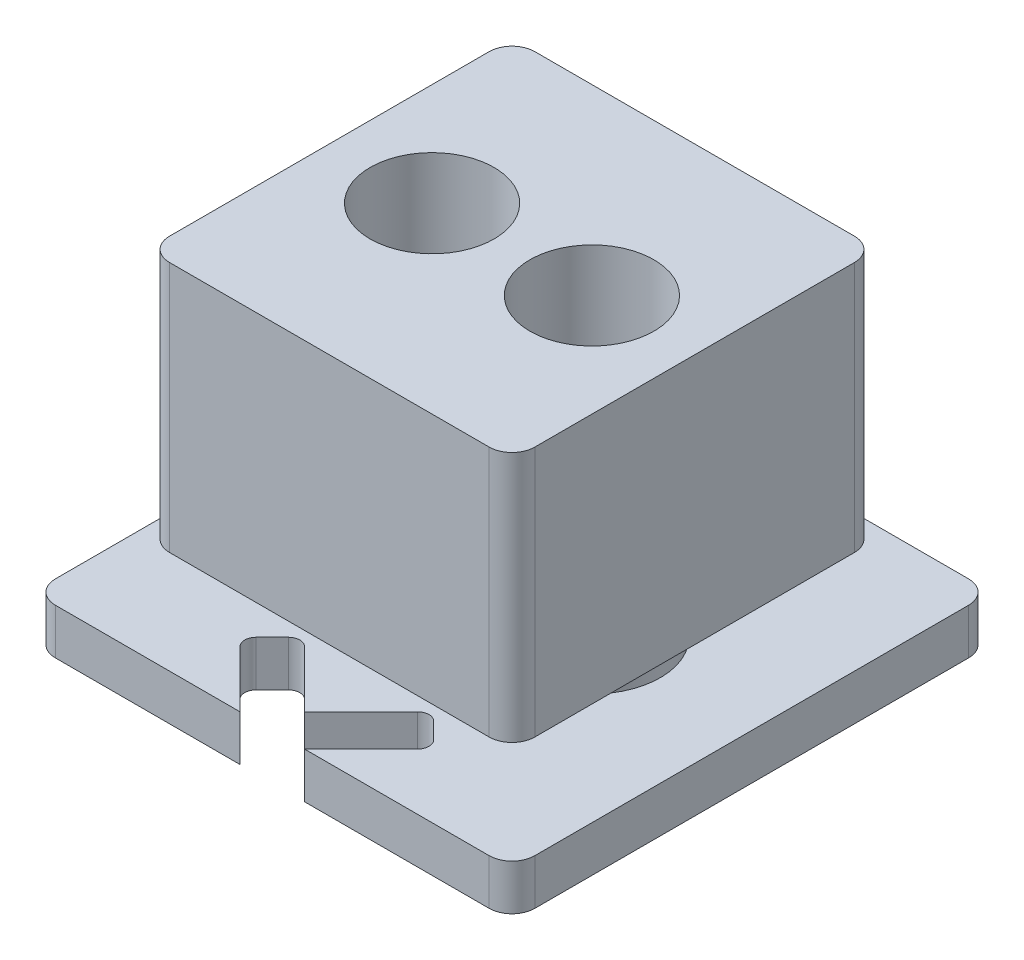
ISO-10303-21;
HEADER;
FILE_DESCRIPTION(('STEP AP214'),'2;1');
FILE_NAME('part.step','',(''),(''),'','','');
FILE_SCHEMA(('AUTOMOTIVE_DESIGN { 1 0 10303 214 1 1 1 1 }'));
ENDSEC;
DATA;
#1=APPLICATION_CONTEXT('core data for automotive mechanical design processes');
#2=APPLICATION_PROTOCOL_DEFINITION('international standard','automotive_design',2000,#1);
#3=PRODUCT_CONTEXT('',#1,'mechanical');
#4=PRODUCT('Part','Part','',(#3));
#5=PRODUCT_RELATED_PRODUCT_CATEGORY('part','',(#4));
#6=PRODUCT_DEFINITION_FORMATION('','',#4);
#7=PRODUCT_DEFINITION_CONTEXT('part definition',#1,'design');
#8=PRODUCT_DEFINITION('design','',#6,#7);
#9=PRODUCT_DEFINITION_SHAPE('','',#8);
#10=(LENGTH_UNIT() NAMED_UNIT(*) SI_UNIT(.MILLI.,.METRE.));
#11=(NAMED_UNIT(*) PLANE_ANGLE_UNIT() SI_UNIT($,.RADIAN.));
#12=(NAMED_UNIT(*) SI_UNIT($,.STERADIAN.) SOLID_ANGLE_UNIT());
#13=UNCERTAINTY_MEASURE_WITH_UNIT(LENGTH_MEASURE(1.E-05),#10,'distance_accuracy_value','');
#14=(GEOMETRIC_REPRESENTATION_CONTEXT(3) GLOBAL_UNCERTAINTY_ASSIGNED_CONTEXT((#13)) GLOBAL_UNIT_ASSIGNED_CONTEXT((#10,
#11,#12)) REPRESENTATION_CONTEXT('',''));
#15=CARTESIAN_POINT('',(0.,0.,0.));
#16=DIRECTION('',(0.,0.,1.));
#17=DIRECTION('',(1.,0.,0.));
#18=AXIS2_PLACEMENT_3D('',#15,#16,#17);
#19=CARTESIAN_POINT('',(-9.5,-2.,10.5));
#20=DIRECTION('',(0.,0.,1.));
#21=DIRECTION('',(1.,0.,0.));
#22=AXIS2_PLACEMENT_3D('',#19,#20,#21);
#23=PLANE('',#22);
#24=DIRECTION('',(-1.,0.,0.));
#25=VECTOR('',#24,1.);
#26=CARTESIAN_POINT('',(-9.5,-4.,10.5));
#27=LINE('',#26,#25);
#28=CARTESIAN_POINT('',(-1.41421356237309,-4.,10.5));
#29=VERTEX_POINT('',#28);
#30=CARTESIAN_POINT('',(-9.5,-4.,10.5));
#31=VERTEX_POINT('',#30);
#32=EDGE_CURVE('E423',#29,#31,#27,.T.);
#33=ORIENTED_EDGE('',*,*,#32,.F.);
#34=DIRECTION('',(0.,1.,0.));
#35=VECTOR('',#34,1.);
#36=CARTESIAN_POINT('',(-1.41421356237309,-4.,10.5));
#37=LINE('',#36,#35);
#38=CARTESIAN_POINT('',(-1.41421356237309,-2.,10.5));
#39=VERTEX_POINT('',#38);
#40=EDGE_CURVE('E324',#29,#39,#37,.T.);
#41=ORIENTED_EDGE('',*,*,#40,.T.);
#42=DIRECTION('',(-1.,0.,0.));
#43=VECTOR('',#42,1.);
#44=CARTESIAN_POINT('',(-9.5,-2.,10.5));
#45=LINE('',#44,#43);
#46=CARTESIAN_POINT('',(-9.5,-2.,10.5));
#47=VERTEX_POINT('',#46);
#48=EDGE_CURVE('E390',#39,#47,#45,.T.);
#49=ORIENTED_EDGE('',*,*,#48,.T.);
#50=DIRECTION('',(0.,-1.,0.));
#51=VECTOR('',#50,1.);
#52=CARTESIAN_POINT('',(-9.5,-2.,10.5));
#53=LINE('',#52,#51);
#54=EDGE_CURVE('E427',#47,#31,#53,.T.);
#55=ORIENTED_EDGE('',*,*,#54,.T.);
#56=EDGE_LOOP('',(#33,#41,#49,#55));
#57=FACE_BOUND('',#56,.T.);
#58=ADVANCED_FACE('F43',(#57),#23,.T.);
#59=CARTESIAN_POINT('',(8.,11.,8.));
#60=DIRECTION('',(-1.,0.,0.));
#61=DIRECTION('',(0.,0.,1.));
#62=AXIS2_PLACEMENT_3D('',#59,#60,#61);
#63=PLANE('',#62);
#64=DIRECTION('',(0.,0.,-1.));
#65=VECTOR('',#64,1.);
#66=CARTESIAN_POINT('',(8.,0.,8.));
#67=LINE('',#66,#65);
#68=CARTESIAN_POINT('',(8.,0.,7.));
#69=VERTEX_POINT('',#68);
#70=CARTESIAN_POINT('',(8.,0.,-7.));
#71=VERTEX_POINT('',#70);
#72=EDGE_CURVE('E463',#69,#71,#67,.T.);
#73=ORIENTED_EDGE('',*,*,#72,.T.);
#74=DIRECTION('',(0.,-1.,0.));
#75=VECTOR('',#74,1.);
#76=CARTESIAN_POINT('',(8.,11.,-7.));
#77=LINE('',#76,#75);
#78=CARTESIAN_POINT('',(8.,11.,-7.));
#79=VERTEX_POINT('',#78);
#80=EDGE_CURVE('E11',#71,#79,#77,.F.);
#81=ORIENTED_EDGE('',*,*,#80,.T.);
#82=DIRECTION('',(0.,0.,-1.));
#83=VECTOR('',#82,1.);
#84=CARTESIAN_POINT('',(8.,11.,8.));
#85=LINE('',#84,#83);
#86=CARTESIAN_POINT('',(8.,11.,7.));
#87=VERTEX_POINT('',#86);
#88=EDGE_CURVE('E464',#87,#79,#85,.T.);
#89=ORIENTED_EDGE('',*,*,#88,.F.);
#90=DIRECTION('',(0.,-1.,0.));
#91=VECTOR('',#90,1.);
#92=CARTESIAN_POINT('',(8.,11.,7.));
#93=LINE('',#92,#91);
#94=EDGE_CURVE('E53',#87,#69,#93,.T.);
#95=ORIENTED_EDGE('',*,*,#94,.T.);
#96=EDGE_LOOP('',(#73,#81,#89,#95));
#97=FACE_BOUND('',#96,.T.);
#98=ADVANCED_FACE('F543',(#97),#63,.F.);
#99=CARTESIAN_POINT('',(-8.,11.,-8.));
#100=DIRECTION('',(0.,0.,1.));
#101=DIRECTION('',(1.,0.,0.));
#102=AXIS2_PLACEMENT_3D('',#99,#100,#101);
#103=PLANE('',#102);
#104=DIRECTION('',(-1.,0.,0.));
#105=VECTOR('',#104,1.);
#106=CARTESIAN_POINT('',(-8.,0.,-8.));
#107=LINE('',#106,#105);
#108=CARTESIAN_POINT('',(7.,0.,-8.));
#109=VERTEX_POINT('',#108);
#110=CARTESIAN_POINT('',(-7.,0.,-8.));
#111=VERTEX_POINT('',#110);
#112=EDGE_CURVE('E484',#109,#111,#107,.T.);
#113=ORIENTED_EDGE('',*,*,#112,.T.);
#114=DIRECTION('',(0.,-1.,0.));
#115=VECTOR('',#114,1.);
#116=CARTESIAN_POINT('',(-7.,11.,-8.));
#117=LINE('',#116,#115);
#118=CARTESIAN_POINT('',(-7.,11.,-8.));
#119=VERTEX_POINT('',#118);
#120=EDGE_CURVE('E516',#111,#119,#117,.F.);
#121=ORIENTED_EDGE('',*,*,#120,.T.);
#122=DIRECTION('',(-1.,0.,0.));
#123=VECTOR('',#122,1.);
#124=CARTESIAN_POINT('',(-8.,11.,-8.));
#125=LINE('',#124,#123);
#126=CARTESIAN_POINT('',(7.,11.,-8.));
#127=VERTEX_POINT('',#126);
#128=EDGE_CURVE('E468',#127,#119,#125,.T.);
#129=ORIENTED_EDGE('',*,*,#128,.F.);
#130=DIRECTION('',(0.,-1.,0.));
#131=VECTOR('',#130,1.);
#132=CARTESIAN_POINT('',(7.,11.,-8.));
#133=LINE('',#132,#131);
#134=EDGE_CURVE('E512',#127,#109,#133,.T.);
#135=ORIENTED_EDGE('',*,*,#134,.T.);
#136=EDGE_LOOP('',(#113,#121,#129,#135));
#137=FACE_BOUND('',#136,.T.);
#138=ADVANCED_FACE('F558',(#137),#103,.F.);
#139=CARTESIAN_POINT('',(-8.,11.,8.));
#140=DIRECTION('',(1.,0.,0.));
#141=DIRECTION('',(0.,0.,-1.));
#142=AXIS2_PLACEMENT_3D('',#139,#140,#141);
#143=PLANE('',#142);
#144=DIRECTION('',(0.,0.,1.));
#145=VECTOR('',#144,1.);
#146=CARTESIAN_POINT('',(-8.,11.,8.));
#147=LINE('',#146,#145);
#148=CARTESIAN_POINT('',(-8.,11.,-7.));
#149=VERTEX_POINT('',#148);
#150=CARTESIAN_POINT('',(-8.,11.,7.));
#151=VERTEX_POINT('',#150);
#152=EDGE_CURVE('E473',#149,#151,#147,.T.);
#153=ORIENTED_EDGE('',*,*,#152,.F.);
#154=DIRECTION('',(0.,-1.,0.));
#155=VECTOR('',#154,1.);
#156=CARTESIAN_POINT('',(-8.,11.,-7.));
#157=LINE('',#156,#155);
#158=CARTESIAN_POINT('',(-8.,0.,-7.));
#159=VERTEX_POINT('',#158);
#160=EDGE_CURVE('E496',#149,#159,#157,.T.);
#161=ORIENTED_EDGE('',*,*,#160,.T.);
#162=DIRECTION('',(0.,0.,1.));
#163=VECTOR('',#162,1.);
#164=CARTESIAN_POINT('',(-8.,0.,8.));
#165=LINE('',#164,#163);
#166=CARTESIAN_POINT('',(-8.,0.,7.));
#167=VERTEX_POINT('',#166);
#168=EDGE_CURVE('E488',#159,#167,#165,.T.);
#169=ORIENTED_EDGE('',*,*,#168,.T.);
#170=DIRECTION('',(0.,-1.,0.));
#171=VECTOR('',#170,1.);
#172=CARTESIAN_POINT('',(-8.,11.,7.));
#173=LINE('',#172,#171);
#174=EDGE_CURVE('E480',#167,#151,#173,.F.);
#175=ORIENTED_EDGE('',*,*,#174,.T.);
#176=EDGE_LOOP('',(#153,#161,#169,#175));
#177=FACE_BOUND('',#176,.T.);
#178=ADVANCED_FACE('F568',(#177),#143,.F.);
#179=CARTESIAN_POINT('',(-8.,11.,8.));
#180=DIRECTION('',(0.,0.,-1.));
#181=DIRECTION('',(-1.,0.,0.));
#182=AXIS2_PLACEMENT_3D('',#179,#180,#181);
#183=PLANE('',#182);
#184=DIRECTION('',(1.,0.,0.));
#185=VECTOR('',#184,1.);
#186=CARTESIAN_POINT('',(-8.,11.,8.));
#187=LINE('',#186,#185);
#188=CARTESIAN_POINT('',(-7.,11.,8.));
#189=VERTEX_POINT('',#188);
#190=CARTESIAN_POINT('',(7.,11.,8.));
#191=VERTEX_POINT('',#190);
#192=EDGE_CURVE('E477',#189,#191,#187,.T.);
#193=ORIENTED_EDGE('',*,*,#192,.F.);
#194=DIRECTION('',(0.,-1.,0.));
#195=VECTOR('',#194,1.);
#196=CARTESIAN_POINT('',(-7.,11.,8.));
#197=LINE('',#196,#195);
#198=CARTESIAN_POINT('',(-7.,0.,8.));
#199=VERTEX_POINT('',#198);
#200=EDGE_CURVE('E533',#189,#199,#197,.T.);
#201=ORIENTED_EDGE('',*,*,#200,.T.);
#202=DIRECTION('',(1.,0.,0.));
#203=VECTOR('',#202,1.);
#204=CARTESIAN_POINT('',(-8.,0.,8.));
#205=LINE('',#204,#203);
#206=CARTESIAN_POINT('',(7.,0.,8.));
#207=VERTEX_POINT('',#206);
#208=EDGE_CURVE('E469',#199,#207,#205,.T.);
#209=ORIENTED_EDGE('',*,*,#208,.T.);
#210=DIRECTION('',(0.,-1.,0.));
#211=VECTOR('',#210,1.);
#212=CARTESIAN_POINT('',(7.,11.,8.));
#213=LINE('',#212,#211);
#214=EDGE_CURVE('E68',#207,#191,#213,.F.);
#215=ORIENTED_EDGE('',*,*,#214,.T.);
#216=EDGE_LOOP('',(#193,#201,#209,#215));
#217=FACE_BOUND('',#216,.T.);
#218=ADVANCED_FACE('F574',(#217),#183,.F.);
#219=CARTESIAN_POINT('',(0.,11.,0.));
#220=DIRECTION('',(0.,-1.,0.));
#221=DIRECTION('',(0.,0.,-1.));
#222=AXIS2_PLACEMENT_3D('',#219,#220,#221);
#223=PLANE('',#222);
#224=CARTESIAN_POINT('',(-3.5,11.,0.));
#225=DIRECTION('',(0.,1.,0.));
#226=DIRECTION('',(0.,0.,1.));
#227=AXIS2_PLACEMENT_3D('',#224,#225,#226);
#228=CIRCLE('',#227,2.715);
#229=CARTESIAN_POINT('',(-3.5,11.,2.715));
#230=VERTEX_POINT('',#229);
#231=EDGE_CURVE('E350',#230,#230,#228,.T.);
#232=ORIENTED_EDGE('',*,*,#231,.F.);
#233=EDGE_LOOP('',(#232));
#234=FACE_BOUND('',#233,.T.);
#235=CARTESIAN_POINT('',(3.5,11.,0.));
#236=DIRECTION('',(0.,1.,0.));
#237=DIRECTION('',(0.,0.,1.));
#238=AXIS2_PLACEMENT_3D('',#235,#236,#237);
#239=CIRCLE('',#238,2.715);
#240=CARTESIAN_POINT('',(3.5,11.,2.715));
#241=VERTEX_POINT('',#240);
#242=EDGE_CURVE('E354',#241,#241,#239,.T.);
#243=ORIENTED_EDGE('',*,*,#242,.F.);
#244=EDGE_LOOP('',(#243));
#245=FACE_BOUND('',#244,.T.);
#246=ORIENTED_EDGE('',*,*,#128,.T.);
#247=CARTESIAN_POINT('',(-7.,11.,-7.));
#248=DIRECTION('',(0.,-1.,0.));
#249=DIRECTION('',(0.,0.,-1.));
#250=AXIS2_PLACEMENT_3D('',#247,#248,#249);
#251=CIRCLE('',#250,1.);
#252=EDGE_CURVE('E528',#119,#149,#251,.F.);
#253=ORIENTED_EDGE('',*,*,#252,.T.);
#254=ORIENTED_EDGE('',*,*,#152,.T.);
#255=CARTESIAN_POINT('',(-7.,11.,7.));
#256=DIRECTION('',(0.,-1.,0.));
#257=DIRECTION('',(0.,0.,-1.));
#258=AXIS2_PLACEMENT_3D('',#255,#256,#257);
#259=CIRCLE('',#258,1.);
#260=EDGE_CURVE('E525',#151,#189,#259,.F.);
#261=ORIENTED_EDGE('',*,*,#260,.T.);
#262=ORIENTED_EDGE('',*,*,#192,.T.);
#263=CARTESIAN_POINT('',(7.,11.,7.));
#264=DIRECTION('',(0.,-1.,0.));
#265=DIRECTION('',(0.,0.,-1.));
#266=AXIS2_PLACEMENT_3D('',#263,#264,#265);
#267=CIRCLE('',#266,1.);
#268=EDGE_CURVE('E519',#191,#87,#267,.F.);
#269=ORIENTED_EDGE('',*,*,#268,.T.);
#270=ORIENTED_EDGE('',*,*,#88,.T.);
#271=CARTESIAN_POINT('',(7.,11.,-7.));
#272=DIRECTION('',(0.,-1.,0.));
#273=DIRECTION('',(0.,0.,-1.));
#274=AXIS2_PLACEMENT_3D('',#271,#272,#273);
#275=CIRCLE('',#274,1.);
#276=EDGE_CURVE('E522',#79,#127,#275,.F.);
#277=ORIENTED_EDGE('',*,*,#276,.T.);
#278=EDGE_LOOP('',(#246,#253,#254,#261,#262,#269,#270,#277));
#279=FACE_BOUND('',#278,.T.);
#280=ADVANCED_FACE('F562',(#234,#245,#279),#223,.F.);
#281=CARTESIAN_POINT('',(0.,0.,0.));
#282=DIRECTION('',(0.,-1.,0.));
#283=DIRECTION('',(0.,0.,-1.));
#284=AXIS2_PLACEMENT_3D('',#281,#282,#283);
#285=PLANE('',#284);
#286=CARTESIAN_POINT('',(3.5,0.,0.));
#287=DIRECTION('',(0.,-1.,0.));
#288=DIRECTION('',(0.,0.,-1.));
#289=AXIS2_PLACEMENT_3D('',#286,#287,#288);
#290=CIRCLE('',#289,3.);
#291=CARTESIAN_POINT('',(3.5,0.,-3.));
#292=VERTEX_POINT('',#291);
#293=EDGE_CURVE('E455',#292,#292,#290,.T.);
#294=ORIENTED_EDGE('',*,*,#293,.F.);
#295=EDGE_LOOP('',(#294));
#296=FACE_BOUND('',#295,.T.);
#297=CARTESIAN_POINT('',(-3.5,0.,0.));
#298=DIRECTION('',(0.,-1.,0.));
#299=DIRECTION('',(0.,0.,-1.));
#300=AXIS2_PLACEMENT_3D('',#297,#298,#299);
#301=CIRCLE('',#300,3.);
#302=CARTESIAN_POINT('',(-3.5,0.,-3.));
#303=VERTEX_POINT('',#302);
#304=EDGE_CURVE('E459',#303,#303,#301,.T.);
#305=ORIENTED_EDGE('',*,*,#304,.F.);
#306=EDGE_LOOP('',(#305));
#307=FACE_BOUND('',#306,.T.);
#308=ORIENTED_EDGE('',*,*,#168,.F.);
#309=CARTESIAN_POINT('',(-7.,0.,-7.));
#310=DIRECTION('',(0.,-1.,0.));
#311=DIRECTION('',(0.,0.,-1.));
#312=AXIS2_PLACEMENT_3D('',#309,#310,#311);
#313=CIRCLE('',#312,1.);
#314=EDGE_CURVE('E509',#159,#111,#313,.T.);
#315=ORIENTED_EDGE('',*,*,#314,.T.);
#316=ORIENTED_EDGE('',*,*,#112,.F.);
#317=CARTESIAN_POINT('',(7.,0.,-7.));
#318=DIRECTION('',(0.,-1.,0.));
#319=DIRECTION('',(0.,0.,-1.));
#320=AXIS2_PLACEMENT_3D('',#317,#318,#319);
#321=CIRCLE('',#320,1.);
#322=EDGE_CURVE('E503',#109,#71,#321,.T.);
#323=ORIENTED_EDGE('',*,*,#322,.T.);
#324=ORIENTED_EDGE('',*,*,#72,.F.);
#325=CARTESIAN_POINT('',(7.,0.,7.));
#326=DIRECTION('',(0.,-1.,0.));
#327=DIRECTION('',(0.,0.,-1.));
#328=AXIS2_PLACEMENT_3D('',#325,#326,#327);
#329=CIRCLE('',#328,1.);
#330=EDGE_CURVE('E500',#69,#207,#329,.T.);
#331=ORIENTED_EDGE('',*,*,#330,.T.);
#332=ORIENTED_EDGE('',*,*,#208,.F.);
#333=CARTESIAN_POINT('',(-7.,0.,7.));
#334=DIRECTION('',(0.,-1.,0.));
#335=DIRECTION('',(0.,0.,-1.));
#336=AXIS2_PLACEMENT_3D('',#333,#334,#335);
#337=CIRCLE('',#336,1.);
#338=EDGE_CURVE('E506',#199,#167,#337,.T.);
#339=ORIENTED_EDGE('',*,*,#338,.T.);
#340=EDGE_LOOP('',(#308,#315,#316,#323,#324,#331,#332,#339));
#341=FACE_BOUND('',#340,.T.);
#342=ADVANCED_FACE('F549',(#296,#307,#341),#285,.T.);
#343=CARTESIAN_POINT('',(-7.,11.,-7.));
#344=DIRECTION('',(0.,-1.,0.));
#345=DIRECTION('',(0.,0.,-1.));
#346=AXIS2_PLACEMENT_3D('',#343,#344,#345);
#347=CYLINDRICAL_SURFACE('',#346,1.);
#348=ORIENTED_EDGE('',*,*,#252,.F.);
#349=ORIENTED_EDGE('',*,*,#120,.F.);
#350=ORIENTED_EDGE('',*,*,#314,.F.);
#351=ORIENTED_EDGE('',*,*,#160,.F.);
#352=EDGE_LOOP('',(#348,#349,#350,#351));
#353=FACE_BOUND('',#352,.T.);
#354=ADVANCED_FACE('F566',(#353),#347,.T.);
#355=CARTESIAN_POINT('',(-7.,11.,7.));
#356=DIRECTION('',(0.,-1.,0.));
#357=DIRECTION('',(0.,0.,-1.));
#358=AXIS2_PLACEMENT_3D('',#355,#356,#357);
#359=CYLINDRICAL_SURFACE('',#358,1.);
#360=ORIENTED_EDGE('',*,*,#260,.F.);
#361=ORIENTED_EDGE('',*,*,#174,.F.);
#362=ORIENTED_EDGE('',*,*,#338,.F.);
#363=ORIENTED_EDGE('',*,*,#200,.F.);
#364=EDGE_LOOP('',(#360,#361,#362,#363));
#365=FACE_BOUND('',#364,.T.);
#366=ADVANCED_FACE('F573',(#365),#359,.T.);
#367=CARTESIAN_POINT('',(7.,11.,-7.));
#368=DIRECTION('',(0.,-1.,0.));
#369=DIRECTION('',(0.,0.,-1.));
#370=AXIS2_PLACEMENT_3D('',#367,#368,#369);
#371=CYLINDRICAL_SURFACE('',#370,1.);
#372=ORIENTED_EDGE('',*,*,#276,.F.);
#373=ORIENTED_EDGE('',*,*,#80,.F.);
#374=ORIENTED_EDGE('',*,*,#322,.F.);
#375=ORIENTED_EDGE('',*,*,#134,.F.);
#376=EDGE_LOOP('',(#372,#373,#374,#375));
#377=FACE_BOUND('',#376,.T.);
#378=ADVANCED_FACE('F555',(#377),#371,.T.);
#379=CARTESIAN_POINT('',(7.,11.,7.));
#380=DIRECTION('',(0.,-1.,0.));
#381=DIRECTION('',(0.,0.,-1.));
#382=AXIS2_PLACEMENT_3D('',#379,#380,#381);
#383=CYLINDRICAL_SURFACE('',#382,1.);
#384=ORIENTED_EDGE('',*,*,#268,.F.);
#385=ORIENTED_EDGE('',*,*,#214,.F.);
#386=ORIENTED_EDGE('',*,*,#330,.F.);
#387=ORIENTED_EDGE('',*,*,#94,.F.);
#388=EDGE_LOOP('',(#384,#385,#386,#387));
#389=FACE_BOUND('',#388,.T.);
#390=ADVANCED_FACE('F45',(#389),#383,.T.);
#391=CARTESIAN_POINT('',(-3.5,-4.,0.));
#392=DIRECTION('',(0.,1.,0.));
#393=DIRECTION('',(0.,0.,1.));
#394=AXIS2_PLACEMENT_3D('',#391,#392,#393);
#395=CYLINDRICAL_SURFACE('',#394,3.);
#396=CARTESIAN_POINT('',(-3.5,-2.,0.));
#397=DIRECTION('',(0.,1.,0.));
#398=DIRECTION('',(0.,0.,1.));
#399=AXIS2_PLACEMENT_3D('',#396,#397,#398);
#400=CIRCLE('',#399,3.);
#401=CARTESIAN_POINT('',(-3.5,-2.,3.));
#402=VERTEX_POINT('',#401);
#403=EDGE_CURVE('E451',#402,#402,#400,.T.);
#404=ORIENTED_EDGE('',*,*,#403,.T.);
#405=EDGE_LOOP('',(#404));
#406=FACE_BOUND('',#405,.T.);
#407=ORIENTED_EDGE('',*,*,#304,.T.);
#408=EDGE_LOOP('',(#407));
#409=FACE_BOUND('',#408,.T.);
#410=ADVANCED_FACE('F576',(#406,#409),#395,.T.);
#411=CARTESIAN_POINT('',(3.5,-4.,0.));
#412=DIRECTION('',(0.,1.,0.));
#413=DIRECTION('',(0.,0.,1.));
#414=AXIS2_PLACEMENT_3D('',#411,#412,#413);
#415=CYLINDRICAL_SURFACE('',#414,3.);
#416=CARTESIAN_POINT('',(3.5,-2.,0.));
#417=DIRECTION('',(0.,1.,0.));
#418=DIRECTION('',(0.,0.,1.));
#419=AXIS2_PLACEMENT_3D('',#416,#417,#418);
#420=CIRCLE('',#419,3.);
#421=CARTESIAN_POINT('',(3.5,-2.,3.));
#422=VERTEX_POINT('',#421);
#423=EDGE_CURVE('E47',#422,#422,#420,.T.);
#424=ORIENTED_EDGE('',*,*,#423,.T.);
#425=EDGE_LOOP('',(#424));
#426=FACE_BOUND('',#425,.T.);
#427=ORIENTED_EDGE('',*,*,#293,.T.);
#428=EDGE_LOOP('',(#427));
#429=FACE_BOUND('',#428,.T.);
#430=ADVANCED_FACE('F581',(#426,#429),#415,.T.);
#431=CARTESIAN_POINT('',(-9.5,-2.,9.5));
#432=DIRECTION('',(0.,-1.,0.));
#433=DIRECTION('',(0.,0.,-1.));
#434=AXIS2_PLACEMENT_3D('',#431,#432,#433);
#435=CYLINDRICAL_SURFACE('',#434,0.999999999999998);
#436=CARTESIAN_POINT('',(-9.5,-4.,9.5));
#437=DIRECTION('',(0.,-1.,0.));
#438=DIRECTION('',(0.,0.,1.));
#439=AXIS2_PLACEMENT_3D('',#436,#437,#438);
#440=CIRCLE('',#439,0.999999999999998);
#441=CARTESIAN_POINT('',(-10.5,-4.,9.5));
#442=VERTEX_POINT('',#441);
#443=EDGE_CURVE('E349',#31,#442,#440,.T.);
#444=ORIENTED_EDGE('',*,*,#443,.F.);
#445=ORIENTED_EDGE('',*,*,#54,.F.);
#446=CARTESIAN_POINT('',(-9.5,-2.,9.5));
#447=DIRECTION('',(0.,-1.,0.));
#448=DIRECTION('',(0.,0.,1.));
#449=AXIS2_PLACEMENT_3D('',#446,#447,#448);
#450=CIRCLE('',#449,0.999999999999998);
#451=CARTESIAN_POINT('',(-10.5,-2.,9.5));
#452=VERTEX_POINT('',#451);
#453=EDGE_CURVE('E361',#47,#452,#450,.T.);
#454=ORIENTED_EDGE('',*,*,#453,.T.);
#455=DIRECTION('',(0.,-1.,0.));
#456=VECTOR('',#455,1.);
#457=CARTESIAN_POINT('',(-10.5,-2.,9.5));
#458=LINE('',#457,#456);
#459=EDGE_CURVE('E395',#452,#442,#458,.T.);
#460=ORIENTED_EDGE('',*,*,#459,.T.);
#461=EDGE_LOOP('',(#444,#445,#454,#460));
#462=FACE_BOUND('',#461,.T.);
#463=ADVANCED_FACE('F597',(#462),#435,.T.);
#464=DIRECTION('',(0.,1.,0.));
#465=VECTOR('',#464,1.);
#466=CARTESIAN_POINT('',(1.41421356237309,-4.,10.5));
#467=LINE('',#466,#465);
#468=CARTESIAN_POINT('',(1.41421356237309,-4.,10.5));
#469=VERTEX_POINT('',#468);
#470=CARTESIAN_POINT('',(1.41421356237309,-2.,10.5));
#471=VERTEX_POINT('',#470);
#472=EDGE_CURVE('E321',#469,#471,#467,.T.);
#473=ORIENTED_EDGE('',*,*,#472,.F.);
#474=CARTESIAN_POINT('',(9.5,-4.,10.5));
#475=VERTEX_POINT('',#474);
#476=EDGE_CURVE('E366',#475,#469,#27,.T.);
#477=ORIENTED_EDGE('',*,*,#476,.F.);
#478=DIRECTION('',(0.,-1.,0.));
#479=VECTOR('',#478,1.);
#480=CARTESIAN_POINT('',(9.5,-2.,10.5));
#481=LINE('',#480,#479);
#482=CARTESIAN_POINT('',(9.5,-2.,10.5));
#483=VERTEX_POINT('',#482);
#484=EDGE_CURVE('E431',#483,#475,#481,.T.);
#485=ORIENTED_EDGE('',*,*,#484,.F.);
#486=EDGE_CURVE('E391',#483,#471,#45,.T.);
#487=ORIENTED_EDGE('',*,*,#486,.T.);
#488=EDGE_LOOP('',(#473,#477,#485,#487));
#489=FACE_BOUND('',#488,.T.);
#490=ADVANCED_FACE('F587',(#489),#23,.T.);
#491=CARTESIAN_POINT('',(9.5,-2.,9.5));
#492=DIRECTION('',(0.,-1.,0.));
#493=DIRECTION('',(0.,0.,-1.));
#494=AXIS2_PLACEMENT_3D('',#491,#492,#493);
#495=CYLINDRICAL_SURFACE('',#494,1.);
#496=CARTESIAN_POINT('',(9.5,-4.,9.5));
#497=DIRECTION('',(0.,-1.,0.));
#498=DIRECTION('',(0.,0.,-1.));
#499=AXIS2_PLACEMENT_3D('',#496,#497,#498);
#500=CIRCLE('',#499,1.);
#501=CARTESIAN_POINT('',(10.5,-4.,9.5));
#502=VERTEX_POINT('',#501);
#503=EDGE_CURVE('E419',#502,#475,#500,.T.);
#504=ORIENTED_EDGE('',*,*,#503,.F.);
#505=DIRECTION('',(0.,-1.,0.));
#506=VECTOR('',#505,1.);
#507=CARTESIAN_POINT('',(10.5,-2.,9.5));
#508=LINE('',#507,#506);
#509=CARTESIAN_POINT('',(10.5,-2.,9.5));
#510=VERTEX_POINT('',#509);
#511=EDGE_CURVE('E434',#510,#502,#508,.T.);
#512=ORIENTED_EDGE('',*,*,#511,.F.);
#513=CARTESIAN_POINT('',(9.5,-2.,9.5));
#514=DIRECTION('',(0.,-1.,0.));
#515=DIRECTION('',(0.,0.,-1.));
#516=AXIS2_PLACEMENT_3D('',#513,#514,#515);
#517=CIRCLE('',#516,1.);
#518=EDGE_CURVE('E386',#510,#483,#517,.T.);
#519=ORIENTED_EDGE('',*,*,#518,.T.);
#520=ORIENTED_EDGE('',*,*,#484,.T.);
#521=EDGE_LOOP('',(#504,#512,#519,#520));
#522=FACE_BOUND('',#521,.T.);
#523=ADVANCED_FACE('F596',(#522),#495,.T.);
#524=CARTESIAN_POINT('',(10.5,-2.,-9.5));
#525=DIRECTION('',(1.,0.,0.));
#526=DIRECTION('',(0.,0.,-1.));
#527=AXIS2_PLACEMENT_3D('',#524,#525,#526);
#528=PLANE('',#527);
#529=DIRECTION('',(0.,0.,1.));
#530=VECTOR('',#529,1.);
#531=CARTESIAN_POINT('',(10.5,-4.,-9.5));
#532=LINE('',#531,#530);
#533=CARTESIAN_POINT('',(10.5,-4.,-9.5));
#534=VERTEX_POINT('',#533);
#535=EDGE_CURVE('E415',#534,#502,#532,.T.);
#536=ORIENTED_EDGE('',*,*,#535,.F.);
#537=DIRECTION('',(0.,-1.,0.));
#538=VECTOR('',#537,1.);
#539=CARTESIAN_POINT('',(10.5,-2.,-9.5));
#540=LINE('',#539,#538);
#541=CARTESIAN_POINT('',(10.5,-2.,-9.5));
#542=VERTEX_POINT('',#541);
#543=EDGE_CURVE('E437',#542,#534,#540,.T.);
#544=ORIENTED_EDGE('',*,*,#543,.F.);
#545=DIRECTION('',(0.,0.,1.));
#546=VECTOR('',#545,1.);
#547=CARTESIAN_POINT('',(10.5,-2.,-9.5));
#548=LINE('',#547,#546);
#549=EDGE_CURVE('E382',#542,#510,#548,.T.);
#550=ORIENTED_EDGE('',*,*,#549,.T.);
#551=ORIENTED_EDGE('',*,*,#511,.T.);
#552=EDGE_LOOP('',(#536,#544,#550,#551));
#553=FACE_BOUND('',#552,.T.);
#554=ADVANCED_FACE('F603',(#553),#528,.T.);
#555=CARTESIAN_POINT('',(9.50000000000001,-2.,-9.5));
#556=DIRECTION('',(0.,-1.,0.));
#557=DIRECTION('',(0.,0.,-1.));
#558=AXIS2_PLACEMENT_3D('',#555,#556,#557);
#559=CYLINDRICAL_SURFACE('',#558,0.999999999999999);
#560=CARTESIAN_POINT('',(9.50000000000001,-4.,-9.5));
#561=DIRECTION('',(0.,-1.,0.));
#562=DIRECTION('',(0.,0.,-1.));
#563=AXIS2_PLACEMENT_3D('',#560,#561,#562);
#564=CIRCLE('',#563,0.999999999999999);
#565=CARTESIAN_POINT('',(9.50000000000001,-4.,-10.5));
#566=VERTEX_POINT('',#565);
#567=EDGE_CURVE('E411',#566,#534,#564,.T.);
#568=ORIENTED_EDGE('',*,*,#567,.F.);
#569=DIRECTION('',(0.,-1.,0.));
#570=VECTOR('',#569,1.);
#571=CARTESIAN_POINT('',(9.50000000000001,-2.,-10.5));
#572=LINE('',#571,#570);
#573=CARTESIAN_POINT('',(9.50000000000001,-2.,-10.5));
#574=VERTEX_POINT('',#573);
#575=EDGE_CURVE('E440',#574,#566,#572,.T.);
#576=ORIENTED_EDGE('',*,*,#575,.F.);
#577=CARTESIAN_POINT('',(9.50000000000001,-2.,-9.5));
#578=DIRECTION('',(0.,-1.,0.));
#579=DIRECTION('',(0.,0.,-1.));
#580=AXIS2_PLACEMENT_3D('',#577,#578,#579);
#581=CIRCLE('',#580,0.999999999999999);
#582=EDGE_CURVE('E378',#574,#542,#581,.T.);
#583=ORIENTED_EDGE('',*,*,#582,.T.);
#584=ORIENTED_EDGE('',*,*,#543,.T.);
#585=EDGE_LOOP('',(#568,#576,#583,#584));
#586=FACE_BOUND('',#585,.T.);
#587=ADVANCED_FACE('F668',(#586),#559,.T.);
#588=CARTESIAN_POINT('',(-9.5,-2.,-10.5));
#589=DIRECTION('',(0.,0.,-1.));
#590=DIRECTION('',(-1.,0.,0.));
#591=AXIS2_PLACEMENT_3D('',#588,#589,#590);
#592=PLANE('',#591);
#593=DIRECTION('',(1.,0.,0.));
#594=VECTOR('',#593,1.);
#595=CARTESIAN_POINT('',(-9.5,-4.,-10.5));
#596=LINE('',#595,#594);
#597=CARTESIAN_POINT('',(-9.5,-4.,-10.5));
#598=VERTEX_POINT('',#597);
#599=EDGE_CURVE('E407',#598,#566,#596,.T.);
#600=ORIENTED_EDGE('',*,*,#599,.F.);
#601=DIRECTION('',(0.,-1.,0.));
#602=VECTOR('',#601,1.);
#603=CARTESIAN_POINT('',(-9.5,-2.,-10.5));
#604=LINE('',#603,#602);
#605=CARTESIAN_POINT('',(-9.5,-2.,-10.5));
#606=VERTEX_POINT('',#605);
#607=EDGE_CURVE('E443',#606,#598,#604,.T.);
#608=ORIENTED_EDGE('',*,*,#607,.F.);
#609=DIRECTION('',(1.,0.,0.));
#610=VECTOR('',#609,1.);
#611=CARTESIAN_POINT('',(-9.5,-2.,-10.5));
#612=LINE('',#611,#610);
#613=EDGE_CURVE('E374',#606,#574,#612,.T.);
#614=ORIENTED_EDGE('',*,*,#613,.T.);
#615=ORIENTED_EDGE('',*,*,#575,.T.);
#616=EDGE_LOOP('',(#600,#608,#614,#615));
#617=FACE_BOUND('',#616,.T.);
#618=ADVANCED_FACE('F664',(#617),#592,.T.);
#619=CARTESIAN_POINT('',(-9.5,-2.,-9.50000000000001));
#620=DIRECTION('',(0.,-1.,0.));
#621=DIRECTION('',(0.,0.,-1.));
#622=AXIS2_PLACEMENT_3D('',#619,#620,#621);
#623=CYLINDRICAL_SURFACE('',#622,0.999999999999999);
#624=CARTESIAN_POINT('',(-9.5,-4.,-9.50000000000001));
#625=DIRECTION('',(0.,-1.,0.));
#626=DIRECTION('',(0.,0.,1.));
#627=AXIS2_PLACEMENT_3D('',#624,#625,#626);
#628=CIRCLE('',#627,0.999999999999999);
#629=CARTESIAN_POINT('',(-10.5,-4.,-9.50000000000001));
#630=VERTEX_POINT('',#629);
#631=EDGE_CURVE('E403',#630,#598,#628,.T.);
#632=ORIENTED_EDGE('',*,*,#631,.F.);
#633=DIRECTION('',(0.,-1.,0.));
#634=VECTOR('',#633,1.);
#635=CARTESIAN_POINT('',(-10.5,-2.,-9.50000000000001));
#636=LINE('',#635,#634);
#637=CARTESIAN_POINT('',(-10.5,-2.,-9.50000000000001));
#638=VERTEX_POINT('',#637);
#639=EDGE_CURVE('E446',#638,#630,#636,.T.);
#640=ORIENTED_EDGE('',*,*,#639,.F.);
#641=CARTESIAN_POINT('',(-9.5,-2.,-9.50000000000001));
#642=DIRECTION('',(0.,-1.,0.));
#643=DIRECTION('',(0.,0.,1.));
#644=AXIS2_PLACEMENT_3D('',#641,#642,#643);
#645=CIRCLE('',#644,0.999999999999999);
#646=EDGE_CURVE('E370',#638,#606,#645,.T.);
#647=ORIENTED_EDGE('',*,*,#646,.T.);
#648=ORIENTED_EDGE('',*,*,#607,.T.);
#649=EDGE_LOOP('',(#632,#640,#647,#648));
#650=FACE_BOUND('',#649,.T.);
#651=ADVANCED_FACE('F660',(#650),#623,.T.);
#652=CARTESIAN_POINT('',(-10.5,-2.,-9.50000000000001));
#653=DIRECTION('',(-1.,0.,0.));
#654=DIRECTION('',(0.,0.,1.));
#655=AXIS2_PLACEMENT_3D('',#652,#653,#654);
#656=PLANE('',#655);
#657=DIRECTION('',(0.,0.,-1.));
#658=VECTOR('',#657,1.);
#659=CARTESIAN_POINT('',(-10.5,-4.,-9.50000000000001));
#660=LINE('',#659,#658);
#661=EDGE_CURVE('E399',#442,#630,#660,.T.);
#662=ORIENTED_EDGE('',*,*,#661,.F.);
#663=ORIENTED_EDGE('',*,*,#459,.F.);
#664=DIRECTION('',(0.,0.,-1.));
#665=VECTOR('',#664,1.);
#666=CARTESIAN_POINT('',(-10.5,-2.,-9.50000000000001));
#667=LINE('',#666,#665);
#668=EDGE_CURVE('E365',#452,#638,#667,.T.);
#669=ORIENTED_EDGE('',*,*,#668,.T.);
#670=ORIENTED_EDGE('',*,*,#639,.T.);
#671=EDGE_LOOP('',(#662,#663,#669,#670));
#672=FACE_BOUND('',#671,.T.);
#673=ADVANCED_FACE('F656',(#672),#656,.T.);
#674=CARTESIAN_POINT('',(-9.5,-2.,9.5));
#675=DIRECTION('',(0.,1.,0.));
#676=DIRECTION('',(0.,0.,1.));
#677=AXIS2_PLACEMENT_3D('',#674,#675,#676);
#678=PLANE('',#677);
#679=DIRECTION('',(0.707106781186549,0.,-0.707106781186546));
#680=VECTOR('',#679,1.);
#681=CARTESIAN_POINT('',(5.95710678118653,-2.,5.95710678118656));
#682=LINE('',#681,#680);
#683=CARTESIAN_POINT('',(3.889087296526,-2.,8.02512626584708));
#684=VERTEX_POINT('',#683);
#685=EDGE_CURVE('E254',#471,#684,#682,.T.);
#686=ORIENTED_EDGE('',*,*,#685,.F.);
#687=ORIENTED_EDGE('',*,*,#486,.F.);
#688=ORIENTED_EDGE('',*,*,#518,.F.);
#689=ORIENTED_EDGE('',*,*,#549,.F.);
#690=ORIENTED_EDGE('',*,*,#582,.F.);
#691=ORIENTED_EDGE('',*,*,#613,.F.);
#692=ORIENTED_EDGE('',*,*,#646,.F.);
#693=ORIENTED_EDGE('',*,*,#668,.F.);
#694=ORIENTED_EDGE('',*,*,#453,.F.);
#695=ORIENTED_EDGE('',*,*,#48,.F.);
#696=DIRECTION('',(-0.707106781186546,0.,-0.707106781186549));
#697=VECTOR('',#696,1.);
#698=CARTESIAN_POINT('',(-5.95710678118655,-2.,5.95710678118653));
#699=LINE('',#698,#697);
#700=CARTESIAN_POINT('',(-3.88908729652601,-2.,8.02512626584708));
#701=VERTEX_POINT('',#700);
#702=EDGE_CURVE('E307',#39,#701,#699,.T.);
#703=ORIENTED_EDGE('',*,*,#702,.T.);
#704=CARTESIAN_POINT('',(-3.53553390593273,-2.,7.6715728752538));
#705=DIRECTION('',(0.,1.,0.));
#706=DIRECTION('',(0.,0.,1.));
#707=AXIS2_PLACEMENT_3D('',#704,#705,#706);
#708=CIRCLE('',#707,0.5);
#709=CARTESIAN_POINT('',(-3.889087296526,-2.,7.31801948466052));
#710=VERTEX_POINT('',#709);
#711=EDGE_CURVE('E303',#710,#701,#708,.T.);
#712=ORIENTED_EDGE('',*,*,#711,.F.);
#713=DIRECTION('',(0.707106781186549,0.,-0.707106781186546));
#714=VECTOR('',#713,1.);
#715=CARTESIAN_POINT('',(1.71446609406727,-2.,1.71446609406727));
#716=LINE('',#715,#714);
#717=CARTESIAN_POINT('',(-3.18198051533946,-2.,6.61091270347398));
#718=VERTEX_POINT('',#717);
#719=EDGE_CURVE('E299',#710,#718,#716,.T.);
#720=ORIENTED_EDGE('',*,*,#719,.T.);
#721=CARTESIAN_POINT('',(-2.82842712474618,-2.,6.96446609406725));
#722=DIRECTION('',(0.,1.,0.));
#723=DIRECTION('',(0.,0.,1.));
#724=AXIS2_PLACEMENT_3D('',#721,#722,#723);
#725=CIRCLE('',#724,0.5);
#726=CARTESIAN_POINT('',(-2.47487373415291,-2.,6.61091270347398));
#727=VERTEX_POINT('',#726);
#728=EDGE_CURVE('E295',#727,#718,#725,.T.);
#729=ORIENTED_EDGE('',*,*,#728,.F.);
#730=DIRECTION('',(-0.707106781186546,0.,-0.707106781186549));
#731=VECTOR('',#730,1.);
#732=CARTESIAN_POINT('',(-4.54289321881345,-2.,4.54289321881343));
#733=LINE('',#732,#731);
#734=CARTESIAN_POINT('',(0.,-2.,9.08578643762691));
#735=VERTEX_POINT('',#734);
#736=EDGE_CURVE('E291',#735,#727,#733,.T.);
#737=ORIENTED_EDGE('',*,*,#736,.F.);
#738=DIRECTION('',(0.707106781186551,0.,-0.707106781186544));
#739=VECTOR('',#738,1.);
#740=CARTESIAN_POINT('',(4.54289321881346,-2.,4.5428932188135));
#741=LINE('',#740,#739);
#742=CARTESIAN_POINT('',(2.47487373415294,-2.,6.610912703474));
#743=VERTEX_POINT('',#742);
#744=EDGE_CURVE('E287',#735,#743,#741,.T.);
#745=ORIENTED_EDGE('',*,*,#744,.T.);
#746=CARTESIAN_POINT('',(2.82842712474621,-2.,6.96446609406728));
#747=DIRECTION('',(0.,1.,0.));
#748=DIRECTION('',(0.,0.,1.));
#749=AXIS2_PLACEMENT_3D('',#746,#747,#748);
#750=CIRCLE('',#749,0.500000000000001);
#751=CARTESIAN_POINT('',(3.18198051533949,-2.,6.610912703474));
#752=VERTEX_POINT('',#751);
#753=EDGE_CURVE('E284',#752,#743,#750,.T.);
#754=ORIENTED_EDGE('',*,*,#753,.F.);
#755=DIRECTION('',(0.707106781186544,0.,0.707106781186551));
#756=VECTOR('',#755,1.);
#757=CARTESIAN_POINT('',(-1.71446609406724,-2.,1.71446609406723));
#758=LINE('',#757,#756);
#759=CARTESIAN_POINT('',(3.88908729652601,-2.,7.31801948466053));
#760=VERTEX_POINT('',#759);
#761=EDGE_CURVE('E232',#752,#760,#758,.T.);
#762=ORIENTED_EDGE('',*,*,#761,.T.);
#763=CARTESIAN_POINT('',(3.53553390593276,-2.,7.67157287525383));
#764=DIRECTION('',(0.,1.,0.));
#765=DIRECTION('',(0.,0.,1.));
#766=AXIS2_PLACEMENT_3D('',#763,#764,#765);
#767=CIRCLE('',#766,0.499999999999983);
#768=EDGE_CURVE('E250',#760,#684,#767,.F.);
#769=ORIENTED_EDGE('',*,*,#768,.T.);
#770=EDGE_LOOP('',(#686,#687,#688,#689,#690,#691,#692,#693,#694,#695,#703,#712,#720,#729,#737,
#745,#754,#762,#769));
#771=FACE_BOUND('',#770,.T.);
#772=ORIENTED_EDGE('',*,*,#403,.F.);
#773=EDGE_LOOP('',(#772));
#774=FACE_BOUND('',#773,.T.);
#775=ORIENTED_EDGE('',*,*,#423,.F.);
#776=EDGE_LOOP('',(#775));
#777=FACE_BOUND('',#776,.T.);
#778=ADVANCED_FACE('F617',(#771,#774,#777),#678,.T.);
#779=CARTESIAN_POINT('',(-3.5,-4.,0.));
#780=DIRECTION('',(0.,-1.,0.));
#781=DIRECTION('',(0.,0.,-1.));
#782=AXIS2_PLACEMENT_3D('',#779,#780,#781);
#783=PLANE('',#782);
#784=DIRECTION('',(0.707106781186549,0.,-0.707106781186546));
#785=VECTOR('',#784,1.);
#786=CARTESIAN_POINT('',(5.95710678118653,-4.,5.95710678118656));
#787=LINE('',#786,#785);
#788=CARTESIAN_POINT('',(3.889087296526,-4.,8.02512626584708));
#789=VERTEX_POINT('',#788);
#790=EDGE_CURVE('E277',#469,#789,#787,.T.);
#791=ORIENTED_EDGE('',*,*,#790,.T.);
#792=CARTESIAN_POINT('',(3.53553390593276,-4.,7.67157287525383));
#793=DIRECTION('',(0.,1.,0.));
#794=DIRECTION('',(0.,0.,1.));
#795=AXIS2_PLACEMENT_3D('',#792,#793,#794);
#796=CIRCLE('',#795,0.499999999999983);
#797=CARTESIAN_POINT('',(3.88908729652601,-4.,7.31801948466053));
#798=VERTEX_POINT('',#797);
#799=EDGE_CURVE('E235',#798,#789,#796,.F.);
#800=ORIENTED_EDGE('',*,*,#799,.F.);
#801=DIRECTION('',(0.707106781186544,0.,0.707106781186551));
#802=VECTOR('',#801,1.);
#803=CARTESIAN_POINT('',(-1.71446609406724,-4.,1.71446609406723));
#804=LINE('',#803,#802);
#805=CARTESIAN_POINT('',(3.18198051533949,-4.,6.610912703474));
#806=VERTEX_POINT('',#805);
#807=EDGE_CURVE('E229',#806,#798,#804,.T.);
#808=ORIENTED_EDGE('',*,*,#807,.F.);
#809=CARTESIAN_POINT('',(2.82842712474621,-4.,6.96446609406728));
#810=DIRECTION('',(0.,1.,0.));
#811=DIRECTION('',(0.,0.,1.));
#812=AXIS2_PLACEMENT_3D('',#809,#810,#811);
#813=CIRCLE('',#812,0.500000000000001);
#814=CARTESIAN_POINT('',(2.47487373415294,-4.,6.610912703474));
#815=VERTEX_POINT('',#814);
#816=EDGE_CURVE('E238',#806,#815,#813,.T.);
#817=ORIENTED_EDGE('',*,*,#816,.T.);
#818=DIRECTION('',(0.707106781186551,0.,-0.707106781186544));
#819=VECTOR('',#818,1.);
#820=CARTESIAN_POINT('',(4.54289321881346,-4.,4.5428932188135));
#821=LINE('',#820,#819);
#822=CARTESIAN_POINT('',(0.,-4.,9.08578643762691));
#823=VERTEX_POINT('',#822);
#824=EDGE_CURVE('E243',#823,#815,#821,.T.);
#825=ORIENTED_EDGE('',*,*,#824,.F.);
#826=DIRECTION('',(-0.707106781186546,0.,-0.707106781186549));
#827=VECTOR('',#826,1.);
#828=CARTESIAN_POINT('',(-4.54289321881345,-4.,4.54289321881343));
#829=LINE('',#828,#827);
#830=CARTESIAN_POINT('',(-2.47487373415291,-4.,6.61091270347398));
#831=VERTEX_POINT('',#830);
#832=EDGE_CURVE('E259',#823,#831,#829,.T.);
#833=ORIENTED_EDGE('',*,*,#832,.T.);
#834=CARTESIAN_POINT('',(-2.82842712474618,-4.,6.96446609406725));
#835=DIRECTION('',(0.,1.,0.));
#836=DIRECTION('',(0.,0.,1.));
#837=AXIS2_PLACEMENT_3D('',#834,#835,#836);
#838=CIRCLE('',#837,0.5);
#839=CARTESIAN_POINT('',(-3.18198051533946,-4.,6.61091270347398));
#840=VERTEX_POINT('',#839);
#841=EDGE_CURVE('E263',#831,#840,#838,.T.);
#842=ORIENTED_EDGE('',*,*,#841,.T.);
#843=DIRECTION('',(0.707106781186549,0.,-0.707106781186546));
#844=VECTOR('',#843,1.);
#845=CARTESIAN_POINT('',(1.71446609406727,-4.,1.71446609406727));
#846=LINE('',#845,#844);
#847=CARTESIAN_POINT('',(-3.889087296526,-4.,7.31801948466052));
#848=VERTEX_POINT('',#847);
#849=EDGE_CURVE('E267',#848,#840,#846,.T.);
#850=ORIENTED_EDGE('',*,*,#849,.F.);
#851=CARTESIAN_POINT('',(-3.53553390593273,-4.,7.6715728752538));
#852=DIRECTION('',(0.,1.,0.));
#853=DIRECTION('',(0.,0.,1.));
#854=AXIS2_PLACEMENT_3D('',#851,#852,#853);
#855=CIRCLE('',#854,0.5);
#856=CARTESIAN_POINT('',(-3.88908729652601,-4.,8.02512626584708));
#857=VERTEX_POINT('',#856);
#858=EDGE_CURVE('E270',#848,#857,#855,.T.);
#859=ORIENTED_EDGE('',*,*,#858,.T.);
#860=DIRECTION('',(-0.707106781186546,0.,-0.707106781186549));
#861=VECTOR('',#860,1.);
#862=CARTESIAN_POINT('',(-5.95710678118655,-4.,5.95710678118653));
#863=LINE('',#862,#861);
#864=EDGE_CURVE('E274',#29,#857,#863,.T.);
#865=ORIENTED_EDGE('',*,*,#864,.F.);
#866=ORIENTED_EDGE('',*,*,#32,.T.);
#867=ORIENTED_EDGE('',*,*,#443,.T.);
#868=ORIENTED_EDGE('',*,*,#661,.T.);
#869=ORIENTED_EDGE('',*,*,#631,.T.);
#870=ORIENTED_EDGE('',*,*,#599,.T.);
#871=ORIENTED_EDGE('',*,*,#567,.T.);
#872=ORIENTED_EDGE('',*,*,#535,.T.);
#873=ORIENTED_EDGE('',*,*,#503,.T.);
#874=ORIENTED_EDGE('',*,*,#476,.T.);
#875=EDGE_LOOP('',(#791,#800,#808,#817,#825,#833,#842,#850,#859,#865,#866,#867,#868,#869,#870,
#871,#872,#873,#874));
#876=FACE_BOUND('',#875,.T.);
#877=CARTESIAN_POINT('',(-3.5,-4.,0.));
#878=DIRECTION('',(0.,1.,0.));
#879=DIRECTION('',(0.,0.,1.));
#880=AXIS2_PLACEMENT_3D('',#877,#878,#879);
#881=CIRCLE('',#880,2.715);
#882=CARTESIAN_POINT('',(-3.5,-4.,2.715));
#883=VERTEX_POINT('',#882);
#884=EDGE_CURVE('E345',#883,#883,#881,.T.);
#885=ORIENTED_EDGE('',*,*,#884,.T.);
#886=EDGE_LOOP('',(#885));
#887=FACE_BOUND('',#886,.T.);
#888=CARTESIAN_POINT('',(3.5,-4.,0.));
#889=DIRECTION('',(0.,1.,0.));
#890=DIRECTION('',(0.,0.,1.));
#891=AXIS2_PLACEMENT_3D('',#888,#889,#890);
#892=CIRCLE('',#891,2.715);
#893=CARTESIAN_POINT('',(3.5,-4.,2.715));
#894=VERTEX_POINT('',#893);
#895=EDGE_CURVE('E317',#894,#894,#892,.T.);
#896=ORIENTED_EDGE('',*,*,#895,.T.);
#897=EDGE_LOOP('',(#896));
#898=FACE_BOUND('',#897,.T.);
#899=ADVANCED_FACE('F247',(#876,#887,#898),#783,.T.);
#900=CARTESIAN_POINT('',(3.5,-4.,0.));
#901=DIRECTION('',(0.,1.,0.));
#902=DIRECTION('',(0.,0.,1.));
#903=AXIS2_PLACEMENT_3D('',#900,#901,#902);
#904=CYLINDRICAL_SURFACE('',#903,2.715);
#905=ORIENTED_EDGE('',*,*,#895,.F.);
#906=EDGE_LOOP('',(#905));
#907=FACE_BOUND('',#906,.T.);
#908=ORIENTED_EDGE('',*,*,#242,.T.);
#909=EDGE_LOOP('',(#908));
#910=FACE_BOUND('',#909,.T.);
#911=ADVANCED_FACE('F687',(#907,#910),#904,.F.);
#912=CARTESIAN_POINT('',(-3.5,-4.,0.));
#913=DIRECTION('',(0.,1.,0.));
#914=DIRECTION('',(0.,0.,1.));
#915=AXIS2_PLACEMENT_3D('',#912,#913,#914);
#916=CYLINDRICAL_SURFACE('',#915,2.715);
#917=ORIENTED_EDGE('',*,*,#884,.F.);
#918=EDGE_LOOP('',(#917));
#919=FACE_BOUND('',#918,.T.);
#920=ORIENTED_EDGE('',*,*,#231,.T.);
#921=EDGE_LOOP('',(#920));
#922=FACE_BOUND('',#921,.T.);
#923=ADVANCED_FACE('F809',(#919,#922),#916,.F.);
#924=CARTESIAN_POINT('',(-1.71446609406724,-4.,1.71446609406723));
#925=DIRECTION('',(-0.707106781186551,0.,0.707106781186544));
#926=DIRECTION('',(0.707106781186544,0.,0.707106781186551));
#927=AXIS2_PLACEMENT_3D('',#924,#925,#926);
#928=PLANE('',#927);
#929=ORIENTED_EDGE('',*,*,#761,.F.);
#930=DIRECTION('',(0.,1.,0.));
#931=VECTOR('',#930,1.);
#932=CARTESIAN_POINT('',(3.18198051533949,-4.,6.610912703474));
#933=LINE('',#932,#931);
#934=EDGE_CURVE('E225',#806,#752,#933,.T.);
#935=ORIENTED_EDGE('',*,*,#934,.F.);
#936=ORIENTED_EDGE('',*,*,#807,.T.);
#937=DIRECTION('',(0.,1.,0.));
#938=VECTOR('',#937,1.);
#939=CARTESIAN_POINT('',(3.88908729652601,-4.,7.31801948466053));
#940=LINE('',#939,#938);
#941=EDGE_CURVE('E314',#798,#760,#940,.T.);
#942=ORIENTED_EDGE('',*,*,#941,.T.);
#943=EDGE_LOOP('',(#929,#935,#936,#942));
#944=FACE_BOUND('',#943,.T.);
#945=ADVANCED_FACE('F226',(#944),#928,.T.);
#946=CARTESIAN_POINT('',(3.53553390593276,-4.,7.67157287525383));
#947=DIRECTION('',(0.,1.,0.));
#948=DIRECTION('',(0.,0.,1.));
#949=AXIS2_PLACEMENT_3D('',#946,#947,#948);
#950=CYLINDRICAL_SURFACE('',#949,0.499999999999983);
#951=ORIENTED_EDGE('',*,*,#768,.F.);
#952=ORIENTED_EDGE('',*,*,#941,.F.);
#953=ORIENTED_EDGE('',*,*,#799,.T.);
#954=DIRECTION('',(0.,1.,0.));
#955=VECTOR('',#954,1.);
#956=CARTESIAN_POINT('',(3.889087296526,-4.,8.02512626584708));
#957=LINE('',#956,#955);
#958=EDGE_CURVE('E318',#789,#684,#957,.T.);
#959=ORIENTED_EDGE('',*,*,#958,.T.);
#960=EDGE_LOOP('',(#951,#952,#953,#959));
#961=FACE_BOUND('',#960,.T.);
#962=ADVANCED_FACE('F622',(#961),#950,.F.);
#963=CARTESIAN_POINT('',(5.95710678118653,-4.,5.95710678118656));
#964=DIRECTION('',(0.707106781186546,0.,0.707106781186549));
#965=DIRECTION('',(0.707106781186549,0.,-0.707106781186546));
#966=AXIS2_PLACEMENT_3D('',#963,#964,#965);
#967=PLANE('',#966);
#968=ORIENTED_EDGE('',*,*,#685,.T.);
#969=ORIENTED_EDGE('',*,*,#958,.F.);
#970=ORIENTED_EDGE('',*,*,#790,.F.);
#971=ORIENTED_EDGE('',*,*,#472,.T.);
#972=EDGE_LOOP('',(#968,#969,#970,#971));
#973=FACE_BOUND('',#972,.T.);
#974=ADVANCED_FACE('F620',(#973),#967,.F.);
#975=CARTESIAN_POINT('',(-5.95710678118655,-4.,5.95710678118653));
#976=DIRECTION('',(0.707106781186549,0.,-0.707106781186546));
#977=DIRECTION('',(-0.707106781186546,0.,-0.707106781186549));
#978=AXIS2_PLACEMENT_3D('',#975,#976,#977);
#979=PLANE('',#978);
#980=ORIENTED_EDGE('',*,*,#702,.F.);
#981=ORIENTED_EDGE('',*,*,#40,.F.);
#982=ORIENTED_EDGE('',*,*,#864,.T.);
#983=DIRECTION('',(0.,1.,0.));
#984=VECTOR('',#983,1.);
#985=CARTESIAN_POINT('',(-3.88908729652601,-4.,8.02512626584708));
#986=LINE('',#985,#984);
#987=EDGE_CURVE('E328',#857,#701,#986,.T.);
#988=ORIENTED_EDGE('',*,*,#987,.T.);
#989=EDGE_LOOP('',(#980,#981,#982,#988));
#990=FACE_BOUND('',#989,.T.);
#991=ADVANCED_FACE('F646',(#990),#979,.T.);
#992=CARTESIAN_POINT('',(-3.53553390593273,-4.,7.6715728752538));
#993=DIRECTION('',(0.,1.,0.));
#994=DIRECTION('',(0.,0.,1.));
#995=AXIS2_PLACEMENT_3D('',#992,#993,#994);
#996=CYLINDRICAL_SURFACE('',#995,0.5);
#997=ORIENTED_EDGE('',*,*,#711,.T.);
#998=ORIENTED_EDGE('',*,*,#987,.F.);
#999=ORIENTED_EDGE('',*,*,#858,.F.);
#1000=DIRECTION('',(0.,1.,0.));
#1001=VECTOR('',#1000,1.);
#1002=CARTESIAN_POINT('',(-3.889087296526,-4.,7.31801948466052));
#1003=LINE('',#1002,#1001);
#1004=EDGE_CURVE('E331',#848,#710,#1003,.T.);
#1005=ORIENTED_EDGE('',*,*,#1004,.T.);
#1006=EDGE_LOOP('',(#997,#998,#999,#1005));
#1007=FACE_BOUND('',#1006,.T.);
#1008=ADVANCED_FACE('F644',(#1007),#996,.F.);
#1009=CARTESIAN_POINT('',(1.71446609406727,-4.,1.71446609406727));
#1010=DIRECTION('',(0.707106781186546,0.,0.707106781186549));
#1011=DIRECTION('',(0.707106781186549,0.,-0.707106781186546));
#1012=AXIS2_PLACEMENT_3D('',#1009,#1010,#1011);
#1013=PLANE('',#1012);
#1014=ORIENTED_EDGE('',*,*,#719,.F.);
#1015=ORIENTED_EDGE('',*,*,#1004,.F.);
#1016=ORIENTED_EDGE('',*,*,#849,.T.);
#1017=DIRECTION('',(0.,1.,0.));
#1018=VECTOR('',#1017,1.);
#1019=CARTESIAN_POINT('',(-3.18198051533946,-4.,6.61091270347398));
#1020=LINE('',#1019,#1018);
#1021=EDGE_CURVE('E334',#840,#718,#1020,.T.);
#1022=ORIENTED_EDGE('',*,*,#1021,.T.);
#1023=EDGE_LOOP('',(#1014,#1015,#1016,#1022));
#1024=FACE_BOUND('',#1023,.T.);
#1025=ADVANCED_FACE('F638',(#1024),#1013,.T.);
#1026=CARTESIAN_POINT('',(-2.82842712474618,-4.,6.96446609406725));
#1027=DIRECTION('',(0.,1.,0.));
#1028=DIRECTION('',(0.,0.,1.));
#1029=AXIS2_PLACEMENT_3D('',#1026,#1027,#1028);
#1030=CYLINDRICAL_SURFACE('',#1029,0.5);
#1031=ORIENTED_EDGE('',*,*,#728,.T.);
#1032=ORIENTED_EDGE('',*,*,#1021,.F.);
#1033=ORIENTED_EDGE('',*,*,#841,.F.);
#1034=DIRECTION('',(0.,1.,0.));
#1035=VECTOR('',#1034,1.);
#1036=CARTESIAN_POINT('',(-2.47487373415291,-4.,6.61091270347398));
#1037=LINE('',#1036,#1035);
#1038=EDGE_CURVE('E337',#831,#727,#1037,.T.);
#1039=ORIENTED_EDGE('',*,*,#1038,.T.);
#1040=EDGE_LOOP('',(#1031,#1032,#1033,#1039));
#1041=FACE_BOUND('',#1040,.T.);
#1042=ADVANCED_FACE('F635',(#1041),#1030,.F.);
#1043=CARTESIAN_POINT('',(-4.54289321881345,-4.,4.54289321881343));
#1044=DIRECTION('',(0.707106781186549,0.,-0.707106781186546));
#1045=DIRECTION('',(-0.707106781186546,0.,-0.707106781186549));
#1046=AXIS2_PLACEMENT_3D('',#1043,#1044,#1045);
#1047=PLANE('',#1046);
#1048=ORIENTED_EDGE('',*,*,#736,.T.);
#1049=ORIENTED_EDGE('',*,*,#1038,.F.);
#1050=ORIENTED_EDGE('',*,*,#832,.F.);
#1051=DIRECTION('',(0.,1.,0.));
#1052=VECTOR('',#1051,1.);
#1053=CARTESIAN_POINT('',(0.,-4.,9.08578643762691));
#1054=LINE('',#1053,#1052);
#1055=EDGE_CURVE('E340',#823,#735,#1054,.T.);
#1056=ORIENTED_EDGE('',*,*,#1055,.T.);
#1057=EDGE_LOOP('',(#1048,#1049,#1050,#1056));
#1058=FACE_BOUND('',#1057,.T.);
#1059=ADVANCED_FACE('F632',(#1058),#1047,.F.);
#1060=CARTESIAN_POINT('',(4.54289321881346,-4.,4.5428932188135));
#1061=DIRECTION('',(0.707106781186544,0.,0.707106781186551));
#1062=DIRECTION('',(0.707106781186551,0.,-0.707106781186544));
#1063=AXIS2_PLACEMENT_3D('',#1060,#1061,#1062);
#1064=PLANE('',#1063);
#1065=ORIENTED_EDGE('',*,*,#744,.F.);
#1066=ORIENTED_EDGE('',*,*,#1055,.F.);
#1067=ORIENTED_EDGE('',*,*,#824,.T.);
#1068=DIRECTION('',(0.,1.,0.));
#1069=VECTOR('',#1068,1.);
#1070=CARTESIAN_POINT('',(2.47487373415294,-4.,6.610912703474));
#1071=LINE('',#1070,#1069);
#1072=EDGE_CURVE('E60',#815,#743,#1071,.T.);
#1073=ORIENTED_EDGE('',*,*,#1072,.T.);
#1074=EDGE_LOOP('',(#1065,#1066,#1067,#1073));
#1075=FACE_BOUND('',#1074,.T.);
#1076=ADVANCED_FACE('F627',(#1075),#1064,.T.);
#1077=CARTESIAN_POINT('',(2.82842712474621,-4.,6.96446609406728));
#1078=DIRECTION('',(0.,1.,0.));
#1079=DIRECTION('',(0.,0.,1.));
#1080=AXIS2_PLACEMENT_3D('',#1077,#1078,#1079);
#1081=CYLINDRICAL_SURFACE('',#1080,0.500000000000001);
#1082=ORIENTED_EDGE('',*,*,#753,.T.);
#1083=ORIENTED_EDGE('',*,*,#1072,.F.);
#1084=ORIENTED_EDGE('',*,*,#816,.F.);
#1085=ORIENTED_EDGE('',*,*,#934,.T.);
#1086=EDGE_LOOP('',(#1082,#1083,#1084,#1085));
#1087=FACE_BOUND('',#1086,.T.);
#1088=ADVANCED_FACE('F239',(#1087),#1081,.F.);
#1089=CLOSED_SHELL('',(#58,#98,#138,#178,#218,#280,#342,#354,#366,#378,#390,#410,#430,#463,#490,
#523,#554,#587,#618,#651,#673,#778,#899,#911,#923,#945,#962,#974,#991,#1008,#1025,#1042,#1059,
#1076,#1088));
#1090=MANIFOLD_SOLID_BREP('B2',#1089);
#1091=ADVANCED_BREP_SHAPE_REPRESENTATION('',(#18,#1090),#14);
#1092=SHAPE_DEFINITION_REPRESENTATION(#9,#1091);
ENDSEC;
END-ISO-10303-21;
